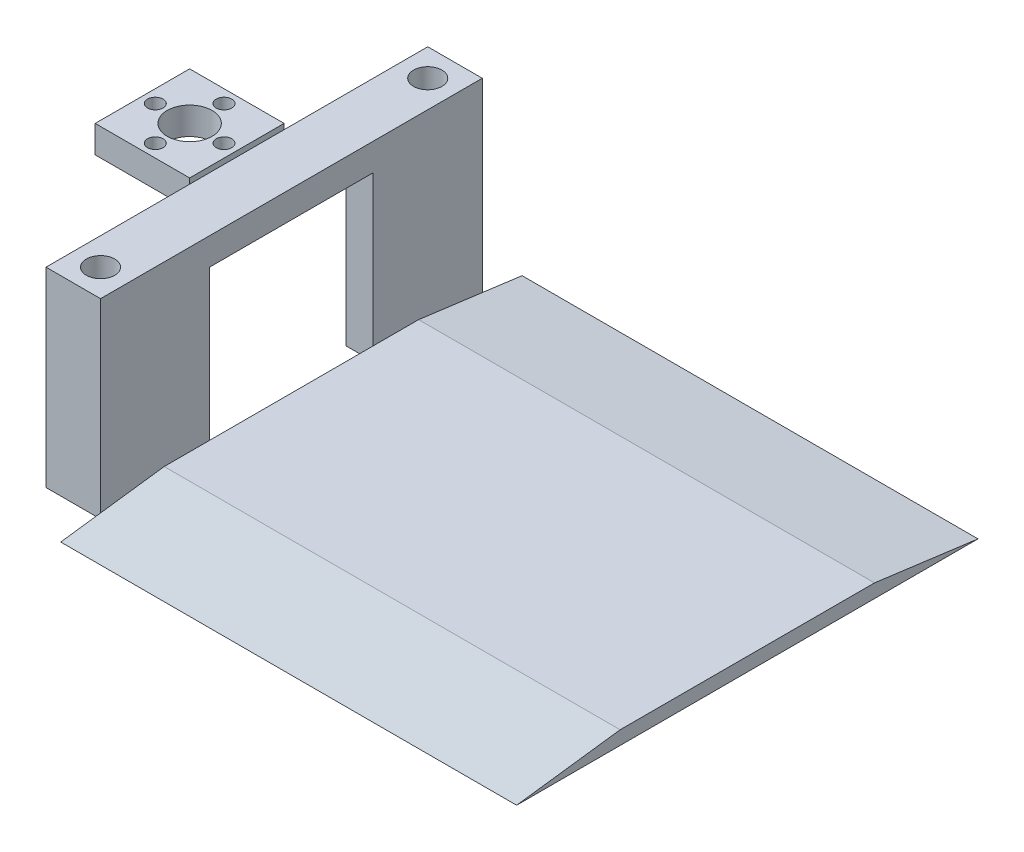
ISO-10303-21;
HEADER;
FILE_DESCRIPTION(('STEP AP214'),'2;1');
FILE_NAME('part.step','',(''),(''),'','','');
FILE_SCHEMA(('AUTOMOTIVE_DESIGN { 1 0 10303 214 1 1 1 1 }'));
ENDSEC;
DATA;
#1=APPLICATION_CONTEXT('core data for automotive mechanical design processes');
#2=APPLICATION_PROTOCOL_DEFINITION('international standard','automotive_design',2000,#1);
#3=PRODUCT_CONTEXT('',#1,'mechanical');
#4=PRODUCT('Part','Part','',(#3));
#5=PRODUCT_RELATED_PRODUCT_CATEGORY('part','',(#4));
#6=PRODUCT_DEFINITION_FORMATION('','',#4);
#7=PRODUCT_DEFINITION_CONTEXT('part definition',#1,'design');
#8=PRODUCT_DEFINITION('design','',#6,#7);
#9=PRODUCT_DEFINITION_SHAPE('','',#8);
#10=(LENGTH_UNIT() NAMED_UNIT(*) SI_UNIT(.MILLI.,.METRE.));
#11=(NAMED_UNIT(*) PLANE_ANGLE_UNIT() SI_UNIT($,.RADIAN.));
#12=(NAMED_UNIT(*) SI_UNIT($,.STERADIAN.) SOLID_ANGLE_UNIT());
#13=UNCERTAINTY_MEASURE_WITH_UNIT(LENGTH_MEASURE(1.E-05),#10,'distance_accuracy_value','');
#14=(GEOMETRIC_REPRESENTATION_CONTEXT(3) GLOBAL_UNCERTAINTY_ASSIGNED_CONTEXT((#13)) GLOBAL_UNIT_ASSIGNED_CONTEXT((#10,
#11,#12)) REPRESENTATION_CONTEXT('',''));
#15=CARTESIAN_POINT('',(0.,0.,0.));
#16=DIRECTION('',(0.,0.,1.));
#17=DIRECTION('',(1.,0.,0.));
#18=AXIS2_PLACEMENT_3D('',#15,#16,#17);
#19=CARTESIAN_POINT('',(-12.7,44.45,-85.471));
#20=DIRECTION('',(1.,0.,0.));
#21=DIRECTION('',(0.,0.,-1.));
#22=AXIS2_PLACEMENT_3D('',#19,#20,#21);
#23=PLANE('',#22);
#24=DIRECTION('',(0.,1.,0.));
#25=VECTOR('',#24,1.);
#26=CARTESIAN_POINT('',(-12.7,39.37,-42.721000029));
#27=LINE('',#26,#25);
#28=CARTESIAN_POINT('',(-12.7,39.37,-42.721000029));
#29=VERTEX_POINT('',#28);
#30=CARTESIAN_POINT('',(-12.7,44.45,-42.721000029));
#31=VERTEX_POINT('',#30);
#32=EDGE_CURVE('E301',#29,#31,#27,.T.);
#33=ORIENTED_EDGE('',*,*,#32,.F.);
#34=DIRECTION('',(0.,0.,-1.));
#35=VECTOR('',#34,1.);
#36=CARTESIAN_POINT('',(-12.7,39.37,-64.720999971));
#37=LINE('',#36,#35);
#38=CARTESIAN_POINT('',(-12.7,39.37,-64.720999971));
#39=VERTEX_POINT('',#38);
#40=EDGE_CURVE('E277',#29,#39,#37,.T.);
#41=ORIENTED_EDGE('',*,*,#40,.T.);
#42=DIRECTION('',(0.,1.,0.));
#43=VECTOR('',#42,1.);
#44=CARTESIAN_POINT('',(-12.7,39.37,-64.720999971));
#45=LINE('',#44,#43);
#46=CARTESIAN_POINT('',(-12.7,44.45,-64.720999971));
#47=VERTEX_POINT('',#46);
#48=EDGE_CURVE('E310',#39,#47,#45,.T.);
#49=ORIENTED_EDGE('',*,*,#48,.T.);
#50=DIRECTION('',(0.,0.,1.));
#51=VECTOR('',#50,1.);
#52=CARTESIAN_POINT('',(-12.7,44.45,-85.471));
#53=LINE('',#52,#51);
#54=CARTESIAN_POINT('',(-12.7,44.45,-98.171));
#55=VERTEX_POINT('',#54);
#56=EDGE_CURVE('E376',#55,#47,#53,.T.);
#57=ORIENTED_EDGE('',*,*,#56,.F.);
#58=DIRECTION('',(0.,-1.,0.));
#59=VECTOR('',#58,1.);
#60=CARTESIAN_POINT('',(-12.7,44.45,-98.171));
#61=LINE('',#60,#59);
#62=CARTESIAN_POINT('',(-12.7,0.,-98.171));
#63=VERTEX_POINT('',#62);
#64=EDGE_CURVE('E388',#55,#63,#61,.T.);
#65=ORIENTED_EDGE('',*,*,#64,.T.);
#66=DIRECTION('',(0.,0.,1.));
#67=VECTOR('',#66,1.);
#68=CARTESIAN_POINT('',(-12.7,0.,-85.471));
#69=LINE('',#68,#67);
#70=CARTESIAN_POINT('',(-12.7,0.,-85.471));
#71=VERTEX_POINT('',#70);
#72=EDGE_CURVE('E382',#63,#71,#69,.T.);
#73=ORIENTED_EDGE('',*,*,#72,.T.);
#74=DIRECTION('',(0.,-1.,0.));
#75=VECTOR('',#74,1.);
#76=CARTESIAN_POINT('',(-12.7,44.45,-85.471));
#77=LINE('',#76,#75);
#78=CARTESIAN_POINT('',(-12.7,38.1,-85.471));
#79=VERTEX_POINT('',#78);
#80=EDGE_CURVE('E379',#79,#71,#77,.T.);
#81=ORIENTED_EDGE('',*,*,#80,.F.);
#82=DIRECTION('',(0.,0.,-1.));
#83=VECTOR('',#82,1.);
#84=CARTESIAN_POINT('',(-12.7,38.1,-7.7719683428763));
#85=LINE('',#84,#83);
#86=CARTESIAN_POINT('',(-12.7,38.1,-21.971));
#87=VERTEX_POINT('',#86);
#88=EDGE_CURVE('E304',#87,#79,#85,.T.);
#89=ORIENTED_EDGE('',*,*,#88,.F.);
#90=DIRECTION('',(0.,-1.,0.));
#91=VECTOR('',#90,1.);
#92=CARTESIAN_POINT('',(-12.7,44.45,-21.971));
#93=LINE('',#92,#91);
#94=CARTESIAN_POINT('',(-12.7,0.,-21.971));
#95=VERTEX_POINT('',#94);
#96=EDGE_CURVE('E342',#87,#95,#93,.T.);
#97=ORIENTED_EDGE('',*,*,#96,.T.);
#98=DIRECTION('',(0.,0.,1.));
#99=VECTOR('',#98,1.);
#100=CARTESIAN_POINT('',(-12.7,0.,-21.971));
#101=LINE('',#100,#99);
#102=CARTESIAN_POINT('',(-12.7,0.,-9.27099999999997));
#103=VERTEX_POINT('',#102);
#104=EDGE_CURVE('E351',#95,#103,#101,.T.);
#105=ORIENTED_EDGE('',*,*,#104,.T.);
#106=DIRECTION('',(0.,-1.,0.));
#107=VECTOR('',#106,1.);
#108=CARTESIAN_POINT('',(-12.7,44.45,-9.27099999999997));
#109=LINE('',#108,#107);
#110=CARTESIAN_POINT('',(-12.7,44.45,-9.27099999999997));
#111=VERTEX_POINT('',#110);
#112=EDGE_CURVE('E331',#111,#103,#109,.T.);
#113=ORIENTED_EDGE('',*,*,#112,.F.);
#114=EDGE_CURVE('E375',#31,#111,#53,.T.);
#115=ORIENTED_EDGE('',*,*,#114,.F.);
#116=EDGE_LOOP('',(#33,#41,#49,#57,#65,#73,#81,#89,#97,#105,#113,#115));
#117=FACE_BOUND('',#116,.T.);
#118=ADVANCED_FACE('F39',(#117),#23,.F.);
#119=CARTESIAN_POINT('',(-12.7,44.45,-85.471));
#120=DIRECTION('',(0.,0.,-1.));
#121=DIRECTION('',(-1.,0.,0.));
#122=AXIS2_PLACEMENT_3D('',#119,#120,#121);
#123=PLANE('',#122);
#124=DIRECTION('',(1.,0.,0.));
#125=VECTOR('',#124,1.);
#126=CARTESIAN_POINT('',(-12.7,0.,-85.471));
#127=LINE('',#126,#125);
#128=CARTESIAN_POINT('',(-6.34999999999998,0.,-85.4710000000001));
#129=VERTEX_POINT('',#128);
#130=EDGE_CURVE('E373',#71,#129,#127,.T.);
#131=ORIENTED_EDGE('',*,*,#130,.T.);
#132=DIRECTION('',(0.,-1.,0.));
#133=VECTOR('',#132,1.);
#134=CARTESIAN_POINT('',(-6.34999999999998,52.2990316571237,-85.4710000000001));
#135=LINE('',#134,#133);
#136=CARTESIAN_POINT('',(-6.34999999999998,38.1,-85.4710000000001));
#137=VERTEX_POINT('',#136);
#138=EDGE_CURVE('E217',#137,#129,#135,.T.);
#139=ORIENTED_EDGE('',*,*,#138,.F.);
#140=DIRECTION('',(1.,0.,0.));
#141=VECTOR('',#140,1.);
#142=CARTESIAN_POINT('',(-12.7,38.1,-85.471));
#143=LINE('',#142,#141);
#144=EDGE_CURVE('E216',#79,#137,#143,.T.);
#145=ORIENTED_EDGE('',*,*,#144,.F.);
#146=ORIENTED_EDGE('',*,*,#80,.T.);
#147=EDGE_LOOP('',(#131,#139,#145,#146));
#148=FACE_BOUND('',#147,.T.);
#149=ADVANCED_FACE('F499',(#148),#123,.F.);
#150=CARTESIAN_POINT('',(-12.7,44.45,-21.971));
#151=DIRECTION('',(0.,0.,1.));
#152=DIRECTION('',(1.,0.,0.));
#153=AXIS2_PLACEMENT_3D('',#150,#151,#152);
#154=PLANE('',#153);
#155=DIRECTION('',(1.,0.,0.));
#156=VECTOR('',#155,1.);
#157=CARTESIAN_POINT('',(-12.7,38.1,-21.971));
#158=LINE('',#157,#156);
#159=CARTESIAN_POINT('',(-6.34999999999999,38.1,-21.971));
#160=VERTEX_POINT('',#159);
#161=EDGE_CURVE('E315',#87,#160,#158,.T.);
#162=ORIENTED_EDGE('',*,*,#161,.T.);
#163=DIRECTION('',(0.,-1.,0.));
#164=VECTOR('',#163,1.);
#165=CARTESIAN_POINT('',(-6.34999999999999,52.2990316571237,-21.971));
#166=LINE('',#165,#164);
#167=CARTESIAN_POINT('',(-6.34999999999999,0.,-21.971));
#168=VERTEX_POINT('',#167);
#169=EDGE_CURVE('E229',#160,#168,#166,.T.);
#170=ORIENTED_EDGE('',*,*,#169,.T.);
#171=DIRECTION('',(-1.,0.,0.));
#172=VECTOR('',#171,1.);
#173=CARTESIAN_POINT('',(-12.7,0.,-21.971));
#174=LINE('',#173,#172);
#175=EDGE_CURVE('E346',#168,#95,#174,.T.);
#176=ORIENTED_EDGE('',*,*,#175,.T.);
#177=ORIENTED_EDGE('',*,*,#96,.F.);
#178=EDGE_LOOP('',(#162,#170,#176,#177));
#179=FACE_BOUND('',#178,.T.);
#180=ADVANCED_FACE('F453',(#179),#154,.F.);
#181=CARTESIAN_POINT('',(0.,3.175,0.));
#182=DIRECTION('',(1.,0.,0.));
#183=DIRECTION('',(0.,0.,-1.));
#184=AXIS2_PLACEMENT_3D('',#181,#182,#183);
#185=PLANE('',#184);
#186=DIRECTION('',(0.,0.,1.));
#187=VECTOR('',#186,1.);
#188=CARTESIAN_POINT('',(0.,0.,0.));
#189=LINE('',#188,#187);
#190=CARTESIAN_POINT('',(0.,0.,-9.27099999999997));
#191=VERTEX_POINT('',#190);
#192=CARTESIAN_POINT('',(0.,0.,0.));
#193=VERTEX_POINT('',#192);
#194=EDGE_CURVE('E390',#191,#193,#189,.T.);
#195=ORIENTED_EDGE('',*,*,#194,.T.);
#196=DIRECTION('',(0.,0.130632606176108,-0.991430845900831));
#197=VECTOR('',#196,1.);
#198=CARTESIAN_POINT('',(0.,0.,0.));
#199=LINE('',#198,#197);
#200=CARTESIAN_POINT('',(0.,1.2215626504522,-9.27099999999997));
#201=VERTEX_POINT('',#200);
#202=EDGE_CURVE('E325',#193,#201,#199,.T.);
#203=ORIENTED_EDGE('',*,*,#202,.T.);
#204=DIRECTION('',(0.,-1.,0.));
#205=VECTOR('',#204,1.);
#206=CARTESIAN_POINT('',(0.,44.45,-9.27099999999997));
#207=LINE('',#206,#205);
#208=EDGE_CURVE('E339',#201,#191,#207,.T.);
#209=ORIENTED_EDGE('',*,*,#208,.T.);
#210=EDGE_LOOP('',(#195,#203,#209));
#211=FACE_BOUND('',#210,.T.);
#212=ADVANCED_FACE('F41',(#211),#185,.F.);
#213=DIRECTION('',(0.,0.,1.));
#214=VECTOR('',#213,1.);
#215=CARTESIAN_POINT('',(0.,3.175,0.));
#216=LINE('',#215,#214);
#217=CARTESIAN_POINT('',(0.,3.17500000000001,-72.771));
#218=VERTEX_POINT('',#217);
#219=CARTESIAN_POINT('',(0.,3.17500000000001,-34.671));
#220=VERTEX_POINT('',#219);
#221=EDGE_CURVE('E396',#218,#220,#216,.T.);
#222=ORIENTED_EDGE('',*,*,#221,.F.);
#223=DIRECTION('',(0.,-1.,0.));
#224=VECTOR('',#223,1.);
#225=CARTESIAN_POINT('',(0.,52.2990316571237,-72.771));
#226=LINE('',#225,#224);
#227=CARTESIAN_POINT('',(0.,0.,-72.771));
#228=VERTEX_POINT('',#227);
#229=EDGE_CURVE('E203',#218,#228,#226,.T.);
#230=ORIENTED_EDGE('',*,*,#229,.T.);
#231=CARTESIAN_POINT('',(0.,0.,-34.671));
#232=VERTEX_POINT('',#231);
#233=EDGE_CURVE('E403',#228,#232,#189,.T.);
#234=ORIENTED_EDGE('',*,*,#233,.T.);
#235=DIRECTION('',(0.,-1.,0.));
#236=VECTOR('',#235,1.);
#237=CARTESIAN_POINT('',(0.,52.2990316571237,-34.671));
#238=LINE('',#237,#236);
#239=EDGE_CURVE('E233',#220,#232,#238,.T.);
#240=ORIENTED_EDGE('',*,*,#239,.F.);
#241=EDGE_LOOP('',(#222,#230,#234,#240));
#242=FACE_BOUND('',#241,.T.);
#243=ADVANCED_FACE('F429',(#242),#185,.F.);
#244=DIRECTION('',(0.,-1.,0.));
#245=VECTOR('',#244,1.);
#246=CARTESIAN_POINT('',(0.,44.45,-98.171));
#247=LINE('',#246,#245);
#248=CARTESIAN_POINT('',(0.,1.22156265045221,-98.171));
#249=VERTEX_POINT('',#248);
#250=CARTESIAN_POINT('',(0.,0.,-98.171));
#251=VERTEX_POINT('',#250);
#252=EDGE_CURVE('E48',#249,#251,#247,.T.);
#253=ORIENTED_EDGE('',*,*,#252,.F.);
#254=DIRECTION('',(0.,-0.130632606176108,-0.991430845900831));
#255=VECTOR('',#254,1.);
#256=CARTESIAN_POINT('',(0.,0.,-107.442));
#257=LINE('',#256,#255);
#258=CARTESIAN_POINT('',(0.,0.,-107.442));
#259=VERTEX_POINT('',#258);
#260=EDGE_CURVE('E333',#249,#259,#257,.T.);
#261=ORIENTED_EDGE('',*,*,#260,.T.);
#262=EDGE_CURVE('E399',#259,#251,#189,.T.);
#263=ORIENTED_EDGE('',*,*,#262,.T.);
#264=EDGE_LOOP('',(#253,#261,#263));
#265=FACE_BOUND('',#264,.T.);
#266=ADVANCED_FACE('F519',(#265),#185,.F.);
#267=CARTESIAN_POINT('',(106.172,3.175,0.));
#268=DIRECTION('',(-1.,0.,0.));
#269=DIRECTION('',(0.,0.,1.));
#270=AXIS2_PLACEMENT_3D('',#267,#268,#269);
#271=PLANE('',#270);
#272=DIRECTION('',(0.,0.,-1.));
#273=VECTOR('',#272,1.);
#274=CARTESIAN_POINT('',(106.172,3.175,0.));
#275=LINE('',#274,#273);
#276=CARTESIAN_POINT('',(106.172,3.175,-24.0965332306971));
#277=VERTEX_POINT('',#276);
#278=CARTESIAN_POINT('',(106.172,3.175,-83.3454667693029));
#279=VERTEX_POINT('',#278);
#280=EDGE_CURVE('E392',#277,#279,#275,.T.);
#281=ORIENTED_EDGE('',*,*,#280,.F.);
#282=DIRECTION('',(0.,0.130632606176108,-0.991430845900831));
#283=VECTOR('',#282,1.);
#284=CARTESIAN_POINT('',(106.172,0.,0.));
#285=LINE('',#284,#283);
#286=CARTESIAN_POINT('',(106.172,0.,0.));
#287=VERTEX_POINT('',#286);
#288=EDGE_CURVE('E321',#287,#277,#285,.T.);
#289=ORIENTED_EDGE('',*,*,#288,.F.);
#290=DIRECTION('',(0.,0.,-1.));
#291=VECTOR('',#290,1.);
#292=CARTESIAN_POINT('',(106.172,0.,0.));
#293=LINE('',#292,#291);
#294=CARTESIAN_POINT('',(106.172,0.,-107.442));
#295=VERTEX_POINT('',#294);
#296=EDGE_CURVE('E404',#287,#295,#293,.T.);
#297=ORIENTED_EDGE('',*,*,#296,.T.);
#298=DIRECTION('',(0.,-0.130632606176108,-0.991430845900831));
#299=VECTOR('',#298,1.);
#300=CARTESIAN_POINT('',(106.172,0.,-107.442));
#301=LINE('',#300,#299);
#302=EDGE_CURVE('E324',#279,#295,#301,.T.);
#303=ORIENTED_EDGE('',*,*,#302,.F.);
#304=EDGE_LOOP('',(#281,#289,#297,#303));
#305=FACE_BOUND('',#304,.T.);
#306=ADVANCED_FACE('F443',(#305),#271,.F.);
#307=CARTESIAN_POINT('',(0.,3.175,0.));
#308=DIRECTION('',(0.,-1.,0.));
#309=DIRECTION('',(0.,0.,-1.));
#310=AXIS2_PLACEMENT_3D('',#307,#308,#309);
#311=PLANE('',#310);
#312=CARTESIAN_POINT('',(0.,3.175,-83.3454667693029));
#313=VERTEX_POINT('',#312);
#314=EDGE_CURVE('E393',#313,#218,#216,.T.);
#315=ORIENTED_EDGE('',*,*,#314,.T.);
#316=ORIENTED_EDGE('',*,*,#221,.T.);
#317=DIRECTION('',(0.,0.,1.));
#318=VECTOR('',#317,1.);
#319=CARTESIAN_POINT('',(0.,3.175,0.));
#320=LINE('',#319,#318);
#321=CARTESIAN_POINT('',(0.,3.175,-24.0965332306971));
#322=VERTEX_POINT('',#321);
#323=EDGE_CURVE('E240',#220,#322,#320,.T.);
#324=ORIENTED_EDGE('',*,*,#323,.T.);
#325=DIRECTION('',(1.,0.,0.));
#326=VECTOR('',#325,1.);
#327=CARTESIAN_POINT('',(-24.3048048487966,3.175,-24.0965332306971));
#328=LINE('',#327,#326);
#329=EDGE_CURVE('E328',#322,#277,#328,.T.);
#330=ORIENTED_EDGE('',*,*,#329,.T.);
#331=ORIENTED_EDGE('',*,*,#280,.T.);
#332=DIRECTION('',(1.,0.,0.));
#333=VECTOR('',#332,1.);
#334=CARTESIAN_POINT('',(-24.3048048487966,3.175,-83.3454667693029));
#335=LINE('',#334,#333);
#336=EDGE_CURVE('E318',#313,#279,#335,.T.);
#337=ORIENTED_EDGE('',*,*,#336,.F.);
#338=EDGE_LOOP('',(#315,#316,#324,#330,#331,#337));
#339=FACE_BOUND('',#338,.T.);
#340=ADVANCED_FACE('F417',(#339),#311,.F.);
#341=CARTESIAN_POINT('',(0.,0.,0.));
#342=DIRECTION('',(0.,-1.,0.));
#343=DIRECTION('',(0.,0.,-1.));
#344=AXIS2_PLACEMENT_3D('',#341,#342,#343);
#345=PLANE('',#344);
#346=ORIENTED_EDGE('',*,*,#175,.F.);
#347=DIRECTION('',(0.,0.,-1.));
#348=VECTOR('',#347,1.);
#349=CARTESIAN_POINT('',(-6.35,0.,-34.671));
#350=LINE('',#349,#348);
#351=CARTESIAN_POINT('',(-6.35,0.,-34.671));
#352=VERTEX_POINT('',#351);
#353=EDGE_CURVE('E224',#168,#352,#350,.T.);
#354=ORIENTED_EDGE('',*,*,#353,.T.);
#355=DIRECTION('',(1.,0.,0.));
#356=VECTOR('',#355,1.);
#357=CARTESIAN_POINT('',(0.,0.,-34.671));
#358=LINE('',#357,#356);
#359=EDGE_CURVE('E226',#352,#232,#358,.T.);
#360=ORIENTED_EDGE('',*,*,#359,.T.);
#361=ORIENTED_EDGE('',*,*,#233,.F.);
#362=DIRECTION('',(-1.,0.,0.));
#363=VECTOR('',#362,1.);
#364=CARTESIAN_POINT('',(0.,0.,-72.771));
#365=LINE('',#364,#363);
#366=CARTESIAN_POINT('',(-6.35,0.,-72.771));
#367=VERTEX_POINT('',#366);
#368=EDGE_CURVE('E219',#228,#367,#365,.T.);
#369=ORIENTED_EDGE('',*,*,#368,.T.);
#370=DIRECTION('',(0.,0.,-1.));
#371=VECTOR('',#370,1.);
#372=CARTESIAN_POINT('',(-6.35,0.,-72.771));
#373=LINE('',#372,#371);
#374=EDGE_CURVE('E210',#367,#129,#373,.T.);
#375=ORIENTED_EDGE('',*,*,#374,.T.);
#376=ORIENTED_EDGE('',*,*,#130,.F.);
#377=ORIENTED_EDGE('',*,*,#72,.F.);
#378=DIRECTION('',(-1.,0.,0.));
#379=VECTOR('',#378,1.);
#380=CARTESIAN_POINT('',(-12.7,0.,-98.171));
#381=LINE('',#380,#379);
#382=EDGE_CURVE('E366',#251,#63,#381,.T.);
#383=ORIENTED_EDGE('',*,*,#382,.F.);
#384=ORIENTED_EDGE('',*,*,#262,.F.);
#385=DIRECTION('',(-1.,0.,0.));
#386=VECTOR('',#385,1.);
#387=CARTESIAN_POINT('',(0.,0.,-107.442));
#388=LINE('',#387,#386);
#389=EDGE_CURVE('E43',#295,#259,#388,.T.);
#390=ORIENTED_EDGE('',*,*,#389,.F.);
#391=ORIENTED_EDGE('',*,*,#296,.F.);
#392=DIRECTION('',(1.,0.,0.));
#393=VECTOR('',#392,1.);
#394=CARTESIAN_POINT('',(0.,0.,0.));
#395=LINE('',#394,#393);
#396=EDGE_CURVE('E402',#193,#287,#395,.T.);
#397=ORIENTED_EDGE('',*,*,#396,.F.);
#398=ORIENTED_EDGE('',*,*,#194,.F.);
#399=DIRECTION('',(1.,0.,0.));
#400=VECTOR('',#399,1.);
#401=CARTESIAN_POINT('',(-12.7,0.,-9.27099999999997));
#402=LINE('',#401,#400);
#403=EDGE_CURVE('E348',#103,#191,#402,.T.);
#404=ORIENTED_EDGE('',*,*,#403,.F.);
#405=ORIENTED_EDGE('',*,*,#104,.F.);
#406=EDGE_LOOP('',(#346,#354,#360,#361,#369,#375,#376,#377,#383,#384,#390,#391,#397,#398,#404,#405));
#407=FACE_BOUND('',#406,.T.);
#408=CARTESIAN_POINT('',(-6.35,0.,-91.821));
#409=DIRECTION('',(0.,1.,0.));
#410=DIRECTION('',(0.,0.,1.));
#411=AXIS2_PLACEMENT_3D('',#408,#409,#410);
#412=CIRCLE('',#411,3.302);
#413=CARTESIAN_POINT('',(-6.35,0.,-88.519));
#414=VERTEX_POINT('',#413);
#415=EDGE_CURVE('E360',#414,#414,#412,.T.);
#416=ORIENTED_EDGE('',*,*,#415,.T.);
#417=EDGE_LOOP('',(#416));
#418=FACE_BOUND('',#417,.T.);
#419=CARTESIAN_POINT('',(-6.35,0.,-15.6210000000001));
#420=DIRECTION('',(0.,1.,0.));
#421=DIRECTION('',(0.,0.,-1.));
#422=AXIS2_PLACEMENT_3D('',#419,#420,#421);
#423=CIRCLE('',#422,3.302);
#424=CARTESIAN_POINT('',(-6.35,0.,-18.9230000000001));
#425=VERTEX_POINT('',#424);
#426=EDGE_CURVE('E357',#425,#425,#423,.T.);
#427=ORIENTED_EDGE('',*,*,#426,.T.);
#428=EDGE_LOOP('',(#427));
#429=FACE_BOUND('',#428,.T.);
#430=ADVANCED_FACE('F438',(#407,#418,#429),#345,.T.);
#431=CARTESIAN_POINT('',(0.,44.45,0.));
#432=DIRECTION('',(0.,-1.,0.));
#433=DIRECTION('',(0.,0.,-1.));
#434=AXIS2_PLACEMENT_3D('',#431,#432,#433);
#435=PLANE('',#434);
#436=DIRECTION('',(0.,0.,-1.));
#437=VECTOR('',#436,1.);
#438=CARTESIAN_POINT('',(0.,44.45,-85.471));
#439=LINE('',#438,#437);
#440=CARTESIAN_POINT('',(0.,44.45,-9.27099999999997));
#441=VERTEX_POINT('',#440);
#442=CARTESIAN_POINT('',(0.,44.45,-98.171));
#443=VERTEX_POINT('',#442);
#444=EDGE_CURVE('E369',#441,#443,#439,.T.);
#445=ORIENTED_EDGE('',*,*,#444,.T.);
#446=DIRECTION('',(-1.,0.,0.));
#447=VECTOR('',#446,1.);
#448=CARTESIAN_POINT('',(-12.7,44.45,-98.171));
#449=LINE('',#448,#447);
#450=EDGE_CURVE('E372',#443,#55,#449,.T.);
#451=ORIENTED_EDGE('',*,*,#450,.T.);
#452=ORIENTED_EDGE('',*,*,#56,.T.);
#453=EDGE_CURVE('E380',#47,#31,#53,.T.);
#454=ORIENTED_EDGE('',*,*,#453,.T.);
#455=ORIENTED_EDGE('',*,*,#114,.T.);
#456=DIRECTION('',(1.,0.,0.));
#457=VECTOR('',#456,1.);
#458=CARTESIAN_POINT('',(-12.7,44.45,-9.27099999999997));
#459=LINE('',#458,#457);
#460=EDGE_CURVE('E345',#111,#441,#459,.T.);
#461=ORIENTED_EDGE('',*,*,#460,.T.);
#462=EDGE_LOOP('',(#445,#451,#452,#454,#455,#461));
#463=FACE_BOUND('',#462,.T.);
#464=CARTESIAN_POINT('',(-6.35,44.45,-91.821));
#465=DIRECTION('',(0.,1.,0.));
#466=DIRECTION('',(0.,0.,1.));
#467=AXIS2_PLACEMENT_3D('',#464,#465,#466);
#468=CIRCLE('',#467,3.302);
#469=CARTESIAN_POINT('',(-6.35,44.45,-88.519));
#470=VERTEX_POINT('',#469);
#471=EDGE_CURVE('E363',#470,#470,#468,.T.);
#472=ORIENTED_EDGE('',*,*,#471,.F.);
#473=EDGE_LOOP('',(#472));
#474=FACE_BOUND('',#473,.T.);
#475=CARTESIAN_POINT('',(-6.35,44.45,-15.6210000000001));
#476=DIRECTION('',(0.,1.,0.));
#477=DIRECTION('',(0.,0.,-1.));
#478=AXIS2_PLACEMENT_3D('',#475,#476,#477);
#479=CIRCLE('',#478,3.302);
#480=CARTESIAN_POINT('',(-6.35,44.45,-18.9230000000001));
#481=VERTEX_POINT('',#480);
#482=EDGE_CURVE('E354',#481,#481,#479,.T.);
#483=ORIENTED_EDGE('',*,*,#482,.F.);
#484=EDGE_LOOP('',(#483));
#485=FACE_BOUND('',#484,.T.);
#486=ADVANCED_FACE('F467',(#463,#474,#485),#435,.F.);
#487=CARTESIAN_POINT('',(0.,44.45,-85.471));
#488=DIRECTION('',(-1.,0.,0.));
#489=DIRECTION('',(0.,0.,1.));
#490=AXIS2_PLACEMENT_3D('',#487,#488,#489);
#491=PLANE('',#490);
#492=EDGE_CURVE('E334',#313,#249,#257,.T.);
#493=ORIENTED_EDGE('',*,*,#492,.T.);
#494=EDGE_CURVE('E11',#443,#249,#247,.T.);
#495=ORIENTED_EDGE('',*,*,#494,.F.);
#496=ORIENTED_EDGE('',*,*,#444,.F.);
#497=EDGE_CURVE('E340',#441,#201,#207,.T.);
#498=ORIENTED_EDGE('',*,*,#497,.T.);
#499=EDGE_CURVE('E323',#201,#322,#199,.T.);
#500=ORIENTED_EDGE('',*,*,#499,.T.);
#501=ORIENTED_EDGE('',*,*,#323,.F.);
#502=CARTESIAN_POINT('',(0.,38.1,-34.671));
#503=VERTEX_POINT('',#502);
#504=EDGE_CURVE('E238',#503,#220,#238,.T.);
#505=ORIENTED_EDGE('',*,*,#504,.F.);
#506=DIRECTION('',(0.,0.,-1.));
#507=VECTOR('',#506,1.);
#508=CARTESIAN_POINT('',(0.,38.1,-7.7719683428763));
#509=LINE('',#508,#507);
#510=CARTESIAN_POINT('',(0.,38.1,-72.771));
#511=VERTEX_POINT('',#510);
#512=EDGE_CURVE('E314',#503,#511,#509,.T.);
#513=ORIENTED_EDGE('',*,*,#512,.T.);
#514=EDGE_CURVE('E56',#511,#218,#226,.T.);
#515=ORIENTED_EDGE('',*,*,#514,.T.);
#516=ORIENTED_EDGE('',*,*,#314,.F.);
#517=EDGE_LOOP('',(#493,#495,#496,#498,#500,#501,#505,#513,#515,#516));
#518=FACE_BOUND('',#517,.T.);
#519=ADVANCED_FACE('F424',(#518),#491,.F.);
#520=CARTESIAN_POINT('',(-12.7,44.45,-98.171));
#521=DIRECTION('',(0.,0.,1.));
#522=DIRECTION('',(1.,0.,0.));
#523=AXIS2_PLACEMENT_3D('',#520,#521,#522);
#524=PLANE('',#523);
#525=ORIENTED_EDGE('',*,*,#382,.T.);
#526=ORIENTED_EDGE('',*,*,#64,.F.);
#527=ORIENTED_EDGE('',*,*,#450,.F.);
#528=ORIENTED_EDGE('',*,*,#494,.T.);
#529=ORIENTED_EDGE('',*,*,#252,.T.);
#530=EDGE_LOOP('',(#525,#526,#527,#528,#529));
#531=FACE_BOUND('',#530,.T.);
#532=ADVANCED_FACE('F508',(#531),#524,.F.);
#533=CARTESIAN_POINT('',(-6.35,44.45,-91.821));
#534=DIRECTION('',(0.,-1.,0.));
#535=DIRECTION('',(0.,0.,-1.));
#536=AXIS2_PLACEMENT_3D('',#533,#534,#535);
#537=CYLINDRICAL_SURFACE('',#536,3.302);
#538=ORIENTED_EDGE('',*,*,#471,.T.);
#539=EDGE_LOOP('',(#538));
#540=FACE_BOUND('',#539,.T.);
#541=ORIENTED_EDGE('',*,*,#415,.F.);
#542=EDGE_LOOP('',(#541));
#543=FACE_BOUND('',#542,.T.);
#544=ADVANCED_FACE('F511',(#540,#543),#537,.F.);
#545=CARTESIAN_POINT('',(-12.7,44.45,-9.27099999999997));
#546=DIRECTION('',(0.,0.,-1.));
#547=DIRECTION('',(-1.,0.,0.));
#548=AXIS2_PLACEMENT_3D('',#545,#546,#547);
#549=PLANE('',#548);
#550=ORIENTED_EDGE('',*,*,#403,.T.);
#551=ORIENTED_EDGE('',*,*,#208,.F.);
#552=ORIENTED_EDGE('',*,*,#497,.F.);
#553=ORIENTED_EDGE('',*,*,#460,.F.);
#554=ORIENTED_EDGE('',*,*,#112,.T.);
#555=EDGE_LOOP('',(#550,#551,#552,#553,#554));
#556=FACE_BOUND('',#555,.T.);
#557=ADVANCED_FACE('F461',(#556),#549,.F.);
#558=CARTESIAN_POINT('',(-6.35,44.45,-15.6210000000001));
#559=DIRECTION('',(0.,-1.,0.));
#560=DIRECTION('',(0.,0.,-1.));
#561=AXIS2_PLACEMENT_3D('',#558,#559,#560);
#562=CYLINDRICAL_SURFACE('',#561,3.302);
#563=ORIENTED_EDGE('',*,*,#482,.T.);
#564=EDGE_LOOP('',(#563));
#565=FACE_BOUND('',#564,.T.);
#566=ORIENTED_EDGE('',*,*,#426,.F.);
#567=EDGE_LOOP('',(#566));
#568=FACE_BOUND('',#567,.T.);
#569=ADVANCED_FACE('F537',(#565,#568),#562,.F.);
#570=CARTESIAN_POINT('',(-24.3048048487966,0.,0.));
#571=DIRECTION('',(0.,-0.991430845900831,-0.130632606176108));
#572=DIRECTION('',(0.,0.130632606176108,-0.991430845900831));
#573=AXIS2_PLACEMENT_3D('',#570,#571,#572);
#574=PLANE('',#573);
#575=ORIENTED_EDGE('',*,*,#396,.T.);
#576=ORIENTED_EDGE('',*,*,#288,.T.);
#577=ORIENTED_EDGE('',*,*,#329,.F.);
#578=ORIENTED_EDGE('',*,*,#499,.F.);
#579=ORIENTED_EDGE('',*,*,#202,.F.);
#580=EDGE_LOOP('',(#575,#576,#577,#578,#579));
#581=FACE_BOUND('',#580,.T.);
#582=ADVANCED_FACE('F441',(#581),#574,.F.);
#583=CARTESIAN_POINT('',(-24.3048048487966,0.,-107.442));
#584=DIRECTION('',(0.,-0.991430845900831,0.130632606176108));
#585=DIRECTION('',(0.,-0.130632606176108,-0.991430845900831));
#586=AXIS2_PLACEMENT_3D('',#583,#584,#585);
#587=PLANE('',#586);
#588=ORIENTED_EDGE('',*,*,#336,.T.);
#589=ORIENTED_EDGE('',*,*,#302,.T.);
#590=ORIENTED_EDGE('',*,*,#389,.T.);
#591=ORIENTED_EDGE('',*,*,#260,.F.);
#592=ORIENTED_EDGE('',*,*,#492,.F.);
#593=EDGE_LOOP('',(#588,#589,#590,#591,#592));
#594=FACE_BOUND('',#593,.T.);
#595=ADVANCED_FACE('F445',(#594),#587,.F.);
#596=CARTESIAN_POINT('',(-12.7,38.1,-7.7719683428763));
#597=DIRECTION('',(0.,1.,0.));
#598=DIRECTION('',(0.,0.,1.));
#599=AXIS2_PLACEMENT_3D('',#596,#597,#598);
#600=PLANE('',#599);
#601=ORIENTED_EDGE('',*,*,#144,.T.);
#602=DIRECTION('',(0.,0.,-1.));
#603=VECTOR('',#602,1.);
#604=CARTESIAN_POINT('',(-6.35,38.1,-72.771));
#605=LINE('',#604,#603);
#606=CARTESIAN_POINT('',(-6.35,38.1,-72.771));
#607=VERTEX_POINT('',#606);
#608=EDGE_CURVE('E207',#607,#137,#605,.T.);
#609=ORIENTED_EDGE('',*,*,#608,.F.);
#610=DIRECTION('',(-1.,0.,0.));
#611=VECTOR('',#610,1.);
#612=CARTESIAN_POINT('',(0.,38.1,-72.771));
#613=LINE('',#612,#611);
#614=EDGE_CURVE('E194',#511,#607,#613,.T.);
#615=ORIENTED_EDGE('',*,*,#614,.F.);
#616=ORIENTED_EDGE('',*,*,#512,.F.);
#617=DIRECTION('',(1.,0.,0.));
#618=VECTOR('',#617,1.);
#619=CARTESIAN_POINT('',(0.,38.1,-34.671));
#620=LINE('',#619,#618);
#621=CARTESIAN_POINT('',(-6.35,38.1,-34.671));
#622=VERTEX_POINT('',#621);
#623=EDGE_CURVE('E64',#622,#503,#620,.T.);
#624=ORIENTED_EDGE('',*,*,#623,.F.);
#625=DIRECTION('',(0.,0.,-1.));
#626=VECTOR('',#625,1.);
#627=CARTESIAN_POINT('',(-6.35,38.1,-34.671));
#628=LINE('',#627,#626);
#629=EDGE_CURVE('E235',#160,#622,#628,.T.);
#630=ORIENTED_EDGE('',*,*,#629,.F.);
#631=ORIENTED_EDGE('',*,*,#161,.F.);
#632=ORIENTED_EDGE('',*,*,#88,.T.);
#633=EDGE_LOOP('',(#601,#609,#615,#616,#624,#630,#631,#632));
#634=FACE_BOUND('',#633,.T.);
#635=ADVANCED_FACE('F214',(#634),#600,.F.);
#636=CARTESIAN_POINT('',(-12.7,39.37,-64.720999971));
#637=DIRECTION('',(1.,0.,0.));
#638=DIRECTION('',(0.,0.,-1.));
#639=AXIS2_PLACEMENT_3D('',#636,#637,#638);
#640=PLANE('',#639);
#641=ORIENTED_EDGE('',*,*,#453,.F.);
#642=CARTESIAN_POINT('',(-12.7,45.72,-64.720999971));
#643=VERTEX_POINT('',#642);
#644=EDGE_CURVE('E290',#47,#643,#45,.T.);
#645=ORIENTED_EDGE('',*,*,#644,.T.);
#646=DIRECTION('',(0.,0.,-1.));
#647=VECTOR('',#646,1.);
#648=CARTESIAN_POINT('',(-12.7,45.72,-64.720999971));
#649=LINE('',#648,#647);
#650=CARTESIAN_POINT('',(-12.7,45.72,-42.721000029));
#651=VERTEX_POINT('',#650);
#652=EDGE_CURVE('E274',#651,#643,#649,.T.);
#653=ORIENTED_EDGE('',*,*,#652,.F.);
#654=EDGE_CURVE('E305',#31,#651,#27,.T.);
#655=ORIENTED_EDGE('',*,*,#654,.F.);
#656=EDGE_LOOP('',(#641,#645,#653,#655));
#657=FACE_BOUND('',#656,.T.);
#658=ADVANCED_FACE('F471',(#657),#640,.T.);
#659=CARTESIAN_POINT('',(-12.7,39.37,-42.721000029));
#660=DIRECTION('',(0.,0.,1.));
#661=DIRECTION('',(1.,0.,0.));
#662=AXIS2_PLACEMENT_3D('',#659,#660,#661);
#663=PLANE('',#662);
#664=DIRECTION('',(1.,0.,0.));
#665=VECTOR('',#664,1.);
#666=CARTESIAN_POINT('',(-12.7,45.72,-42.721000029));
#667=LINE('',#666,#665);
#668=CARTESIAN_POINT('',(-34.699999942,45.72,-42.721000029));
#669=VERTEX_POINT('',#668);
#670=EDGE_CURVE('E281',#669,#651,#667,.T.);
#671=ORIENTED_EDGE('',*,*,#670,.F.);
#672=DIRECTION('',(0.,1.,0.));
#673=VECTOR('',#672,1.);
#674=CARTESIAN_POINT('',(-34.699999942,39.37,-42.721000029));
#675=LINE('',#674,#673);
#676=CARTESIAN_POINT('',(-34.699999942,39.37,-42.721000029));
#677=VERTEX_POINT('',#676);
#678=EDGE_CURVE('E306',#677,#669,#675,.T.);
#679=ORIENTED_EDGE('',*,*,#678,.F.);
#680=DIRECTION('',(1.,0.,0.));
#681=VECTOR('',#680,1.);
#682=CARTESIAN_POINT('',(-12.7,39.37,-42.721000029));
#683=LINE('',#682,#681);
#684=EDGE_CURVE('E287',#677,#29,#683,.T.);
#685=ORIENTED_EDGE('',*,*,#684,.T.);
#686=ORIENTED_EDGE('',*,*,#32,.T.);
#687=ORIENTED_EDGE('',*,*,#654,.T.);
#688=EDGE_LOOP('',(#671,#679,#685,#686,#687));
#689=FACE_BOUND('',#688,.T.);
#690=ADVANCED_FACE('F488',(#689),#663,.T.);
#691=CARTESIAN_POINT('',(-34.699999942,39.37,-64.720999971));
#692=DIRECTION('',(-1.,0.,0.));
#693=DIRECTION('',(0.,0.,1.));
#694=AXIS2_PLACEMENT_3D('',#691,#692,#693);
#695=PLANE('',#694);
#696=DIRECTION('',(0.,0.,1.));
#697=VECTOR('',#696,1.);
#698=CARTESIAN_POINT('',(-34.699999942,45.72,-64.720999971));
#699=LINE('',#698,#697);
#700=CARTESIAN_POINT('',(-34.699999942,45.72,-64.720999971));
#701=VERTEX_POINT('',#700);
#702=EDGE_CURVE('E296',#701,#669,#699,.T.);
#703=ORIENTED_EDGE('',*,*,#702,.F.);
#704=DIRECTION('',(0.,1.,0.));
#705=VECTOR('',#704,1.);
#706=CARTESIAN_POINT('',(-34.699999942,39.37,-64.720999971));
#707=LINE('',#706,#705);
#708=CARTESIAN_POINT('',(-34.699999942,39.37,-64.720999971));
#709=VERTEX_POINT('',#708);
#710=EDGE_CURVE('E308',#709,#701,#707,.T.);
#711=ORIENTED_EDGE('',*,*,#710,.F.);
#712=DIRECTION('',(0.,0.,1.));
#713=VECTOR('',#712,1.);
#714=CARTESIAN_POINT('',(-34.699999942,39.37,-64.720999971));
#715=LINE('',#714,#713);
#716=EDGE_CURVE('E284',#709,#677,#715,.T.);
#717=ORIENTED_EDGE('',*,*,#716,.T.);
#718=ORIENTED_EDGE('',*,*,#678,.T.);
#719=EDGE_LOOP('',(#703,#711,#717,#718));
#720=FACE_BOUND('',#719,.T.);
#721=ADVANCED_FACE('F483',(#720),#695,.T.);
#722=CARTESIAN_POINT('',(-12.7,39.37,-64.720999971));
#723=DIRECTION('',(0.,0.,-1.));
#724=DIRECTION('',(-1.,0.,0.));
#725=AXIS2_PLACEMENT_3D('',#722,#723,#724);
#726=PLANE('',#725);
#727=DIRECTION('',(-1.,0.,0.));
#728=VECTOR('',#727,1.);
#729=CARTESIAN_POINT('',(-12.7,45.72,-64.720999971));
#730=LINE('',#729,#728);
#731=EDGE_CURVE('E293',#643,#701,#730,.T.);
#732=ORIENTED_EDGE('',*,*,#731,.F.);
#733=ORIENTED_EDGE('',*,*,#644,.F.);
#734=ORIENTED_EDGE('',*,*,#48,.F.);
#735=DIRECTION('',(-1.,0.,0.));
#736=VECTOR('',#735,1.);
#737=CARTESIAN_POINT('',(-12.7,39.37,-64.720999971));
#738=LINE('',#737,#736);
#739=EDGE_CURVE('E280',#39,#709,#738,.T.);
#740=ORIENTED_EDGE('',*,*,#739,.T.);
#741=ORIENTED_EDGE('',*,*,#710,.T.);
#742=EDGE_LOOP('',(#732,#733,#734,#740,#741));
#743=FACE_BOUND('',#742,.T.);
#744=ADVANCED_FACE('F476',(#743),#726,.T.);
#745=CARTESIAN_POINT('',(0.,39.37,0.));
#746=DIRECTION('',(0.,-1.,0.));
#747=DIRECTION('',(0.,0.,-1.));
#748=AXIS2_PLACEMENT_3D('',#745,#746,#747);
#749=PLANE('',#748);
#750=CARTESIAN_POINT('',(-31.6999999729998,39.37,-53.7209999999999));
#751=DIRECTION('',(0.,1.,0.));
#752=DIRECTION('',(0.,0.,1.));
#753=AXIS2_PLACEMENT_3D('',#750,#751,#752);
#754=CIRCLE('',#753,1.813500056);
#755=CARTESIAN_POINT('',(-31.6999999729998,39.37,-51.9074999439999));
#756=VERTEX_POINT('',#755);
#757=EDGE_CURVE('E247',#756,#756,#754,.T.);
#758=ORIENTED_EDGE('',*,*,#757,.T.);
#759=EDGE_LOOP('',(#758));
#760=FACE_BOUND('',#759,.T.);
#761=CARTESIAN_POINT('',(-23.6999999709997,39.37,-45.720999998));
#762=DIRECTION('',(0.,1.,0.));
#763=DIRECTION('',(0.,0.,1.));
#764=AXIS2_PLACEMENT_3D('',#761,#762,#763);
#765=CIRCLE('',#764,1.813500056);
#766=CARTESIAN_POINT('',(-23.6999999709997,39.37,-43.907499942));
#767=VERTEX_POINT('',#766);
#768=EDGE_CURVE('E253',#767,#767,#765,.T.);
#769=ORIENTED_EDGE('',*,*,#768,.T.);
#770=EDGE_LOOP('',(#769));
#771=FACE_BOUND('',#770,.T.);
#772=CARTESIAN_POINT('',(-15.6999999689998,39.37,-53.7210000000002));
#773=DIRECTION('',(0.,1.,0.));
#774=DIRECTION('',(0.,0.,1.));
#775=AXIS2_PLACEMENT_3D('',#772,#773,#774);
#776=CIRCLE('',#775,1.813500056);
#777=CARTESIAN_POINT('',(-15.6999999689998,39.37,-51.9074999440002));
#778=VERTEX_POINT('',#777);
#779=EDGE_CURVE('E259',#778,#778,#776,.T.);
#780=ORIENTED_EDGE('',*,*,#779,.T.);
#781=EDGE_LOOP('',(#780));
#782=FACE_BOUND('',#781,.T.);
#783=CARTESIAN_POINT('',(-23.699999971,39.37,-61.721000002));
#784=DIRECTION('',(0.,1.,0.));
#785=DIRECTION('',(0.,0.,1.));
#786=AXIS2_PLACEMENT_3D('',#783,#784,#785);
#787=CIRCLE('',#786,1.813500056);
#788=CARTESIAN_POINT('',(-23.699999971,39.37,-59.907499946));
#789=VERTEX_POINT('',#788);
#790=EDGE_CURVE('E265',#789,#789,#787,.T.);
#791=ORIENTED_EDGE('',*,*,#790,.T.);
#792=EDGE_LOOP('',(#791));
#793=FACE_BOUND('',#792,.T.);
#794=CARTESIAN_POINT('',(-23.699999971,39.37,-53.721));
#795=DIRECTION('',(0.,1.,0.));
#796=DIRECTION('',(0.,0.,1.));
#797=AXIS2_PLACEMENT_3D('',#794,#795,#796);
#798=CIRCLE('',#797,5.22699996);
#799=CARTESIAN_POINT('',(-23.699999971,39.37,-48.49400004));
#800=VERTEX_POINT('',#799);
#801=EDGE_CURVE('E271',#800,#800,#798,.T.);
#802=ORIENTED_EDGE('',*,*,#801,.T.);
#803=EDGE_LOOP('',(#802));
#804=FACE_BOUND('',#803,.T.);
#805=ORIENTED_EDGE('',*,*,#40,.F.);
#806=ORIENTED_EDGE('',*,*,#684,.F.);
#807=ORIENTED_EDGE('',*,*,#716,.F.);
#808=ORIENTED_EDGE('',*,*,#739,.F.);
#809=EDGE_LOOP('',(#805,#806,#807,#808));
#810=FACE_BOUND('',#809,.T.);
#811=ADVANCED_FACE('F479',(#760,#771,#782,#793,#804,#810),#749,.T.);
#812=CARTESIAN_POINT('',(0.,45.72,0.));
#813=DIRECTION('',(0.,-1.,0.));
#814=DIRECTION('',(0.,0.,-1.));
#815=AXIS2_PLACEMENT_3D('',#812,#813,#814);
#816=PLANE('',#815);
#817=CARTESIAN_POINT('',(-31.6999999729998,45.72,-53.7209999999999));
#818=DIRECTION('',(0.,1.,0.));
#819=DIRECTION('',(0.,0.,1.));
#820=AXIS2_PLACEMENT_3D('',#817,#818,#819);
#821=CIRCLE('',#820,1.813500056);
#822=CARTESIAN_POINT('',(-31.6999999729998,45.72,-51.9074999439999));
#823=VERTEX_POINT('',#822);
#824=EDGE_CURVE('E246',#823,#823,#821,.T.);
#825=ORIENTED_EDGE('',*,*,#824,.F.);
#826=EDGE_LOOP('',(#825));
#827=FACE_BOUND('',#826,.T.);
#828=CARTESIAN_POINT('',(-23.6999999709997,45.72,-45.720999998));
#829=DIRECTION('',(0.,1.,0.));
#830=DIRECTION('',(0.,0.,1.));
#831=AXIS2_PLACEMENT_3D('',#828,#829,#830);
#832=CIRCLE('',#831,1.813500056);
#833=CARTESIAN_POINT('',(-23.6999999709997,45.72,-43.907499942));
#834=VERTEX_POINT('',#833);
#835=EDGE_CURVE('E250',#834,#834,#832,.T.);
#836=ORIENTED_EDGE('',*,*,#835,.F.);
#837=EDGE_LOOP('',(#836));
#838=FACE_BOUND('',#837,.T.);
#839=CARTESIAN_POINT('',(-15.6999999689998,45.72,-53.7210000000002));
#840=DIRECTION('',(0.,1.,0.));
#841=DIRECTION('',(0.,0.,1.));
#842=AXIS2_PLACEMENT_3D('',#839,#840,#841);
#843=CIRCLE('',#842,1.813500056);
#844=CARTESIAN_POINT('',(-15.6999999689998,45.72,-51.9074999440002));
#845=VERTEX_POINT('',#844);
#846=EDGE_CURVE('E256',#845,#845,#843,.T.);
#847=ORIENTED_EDGE('',*,*,#846,.F.);
#848=EDGE_LOOP('',(#847));
#849=FACE_BOUND('',#848,.T.);
#850=CARTESIAN_POINT('',(-23.699999971,45.72,-61.721000002));
#851=DIRECTION('',(0.,1.,0.));
#852=DIRECTION('',(0.,0.,1.));
#853=AXIS2_PLACEMENT_3D('',#850,#851,#852);
#854=CIRCLE('',#853,1.813500056);
#855=CARTESIAN_POINT('',(-23.699999971,45.72,-59.907499946));
#856=VERTEX_POINT('',#855);
#857=EDGE_CURVE('E262',#856,#856,#854,.T.);
#858=ORIENTED_EDGE('',*,*,#857,.F.);
#859=EDGE_LOOP('',(#858));
#860=FACE_BOUND('',#859,.T.);
#861=CARTESIAN_POINT('',(-23.699999971,45.72,-53.721));
#862=DIRECTION('',(0.,1.,0.));
#863=DIRECTION('',(0.,0.,1.));
#864=AXIS2_PLACEMENT_3D('',#861,#862,#863);
#865=CIRCLE('',#864,5.22699996);
#866=CARTESIAN_POINT('',(-23.699999971,45.72,-48.49400004));
#867=VERTEX_POINT('',#866);
#868=EDGE_CURVE('E268',#867,#867,#865,.T.);
#869=ORIENTED_EDGE('',*,*,#868,.F.);
#870=EDGE_LOOP('',(#869));
#871=FACE_BOUND('',#870,.T.);
#872=ORIENTED_EDGE('',*,*,#652,.T.);
#873=ORIENTED_EDGE('',*,*,#731,.T.);
#874=ORIENTED_EDGE('',*,*,#702,.T.);
#875=ORIENTED_EDGE('',*,*,#670,.T.);
#876=EDGE_LOOP('',(#872,#873,#874,#875));
#877=FACE_BOUND('',#876,.T.);
#878=ADVANCED_FACE('F485',(#827,#838,#849,#860,#871,#877),#816,.F.);
#879=CARTESIAN_POINT('',(-23.699999971,39.37,-53.721));
#880=DIRECTION('',(0.,1.,0.));
#881=DIRECTION('',(0.,0.,1.));
#882=AXIS2_PLACEMENT_3D('',#879,#880,#881);
#883=CYLINDRICAL_SURFACE('',#882,5.22699996);
#884=ORIENTED_EDGE('',*,*,#801,.F.);
#885=EDGE_LOOP('',(#884));
#886=FACE_BOUND('',#885,.T.);
#887=ORIENTED_EDGE('',*,*,#868,.T.);
#888=EDGE_LOOP('',(#887));
#889=FACE_BOUND('',#888,.T.);
#890=ADVANCED_FACE('F633',(#886,#889),#883,.F.);
#891=CARTESIAN_POINT('',(-23.699999971,39.37,-61.721000002));
#892=DIRECTION('',(0.,1.,0.));
#893=DIRECTION('',(0.,0.,1.));
#894=AXIS2_PLACEMENT_3D('',#891,#892,#893);
#895=CYLINDRICAL_SURFACE('',#894,1.813500056);
#896=ORIENTED_EDGE('',*,*,#790,.F.);
#897=EDGE_LOOP('',(#896));
#898=FACE_BOUND('',#897,.T.);
#899=ORIENTED_EDGE('',*,*,#857,.T.);
#900=EDGE_LOOP('',(#899));
#901=FACE_BOUND('',#900,.T.);
#902=ADVANCED_FACE('F643',(#898,#901),#895,.F.);
#903=CARTESIAN_POINT('',(-15.6999999689998,39.37,-53.7210000000002));
#904=DIRECTION('',(0.,1.,0.));
#905=DIRECTION('',(0.,0.,1.));
#906=AXIS2_PLACEMENT_3D('',#903,#904,#905);
#907=CYLINDRICAL_SURFACE('',#906,1.813500056);
#908=ORIENTED_EDGE('',*,*,#779,.F.);
#909=EDGE_LOOP('',(#908));
#910=FACE_BOUND('',#909,.T.);
#911=ORIENTED_EDGE('',*,*,#846,.T.);
#912=EDGE_LOOP('',(#911));
#913=FACE_BOUND('',#912,.T.);
#914=ADVANCED_FACE('F654',(#910,#913),#907,.F.);
#915=CARTESIAN_POINT('',(-23.6999999709997,39.37,-45.720999998));
#916=DIRECTION('',(0.,1.,0.));
#917=DIRECTION('',(0.,0.,1.));
#918=AXIS2_PLACEMENT_3D('',#915,#916,#917);
#919=CYLINDRICAL_SURFACE('',#918,1.813500056);
#920=ORIENTED_EDGE('',*,*,#768,.F.);
#921=EDGE_LOOP('',(#920));
#922=FACE_BOUND('',#921,.T.);
#923=ORIENTED_EDGE('',*,*,#835,.T.);
#924=EDGE_LOOP('',(#923));
#925=FACE_BOUND('',#924,.T.);
#926=ADVANCED_FACE('F665',(#922,#925),#919,.F.);
#927=CARTESIAN_POINT('',(-31.6999999729998,39.37,-53.7209999999999));
#928=DIRECTION('',(0.,1.,0.));
#929=DIRECTION('',(0.,0.,1.));
#930=AXIS2_PLACEMENT_3D('',#927,#928,#929);
#931=CYLINDRICAL_SURFACE('',#930,1.813500056);
#932=ORIENTED_EDGE('',*,*,#757,.F.);
#933=EDGE_LOOP('',(#932));
#934=FACE_BOUND('',#933,.T.);
#935=ORIENTED_EDGE('',*,*,#824,.T.);
#936=EDGE_LOOP('',(#935));
#937=FACE_BOUND('',#936,.T.);
#938=ADVANCED_FACE('F676',(#934,#937),#931,.F.);
#939=CARTESIAN_POINT('',(-6.35,52.2990316571237,-34.671));
#940=DIRECTION('',(-1.,0.,0.));
#941=DIRECTION('',(0.,0.,1.));
#942=AXIS2_PLACEMENT_3D('',#939,#940,#941);
#943=PLANE('',#942);
#944=ORIENTED_EDGE('',*,*,#169,.F.);
#945=ORIENTED_EDGE('',*,*,#629,.T.);
#946=DIRECTION('',(0.,-1.,0.));
#947=VECTOR('',#946,1.);
#948=CARTESIAN_POINT('',(-6.35,52.2990316571237,-34.671));
#949=LINE('',#948,#947);
#950=EDGE_CURVE('E234',#622,#352,#949,.T.);
#951=ORIENTED_EDGE('',*,*,#950,.T.);
#952=ORIENTED_EDGE('',*,*,#353,.F.);
#953=EDGE_LOOP('',(#944,#945,#951,#952));
#954=FACE_BOUND('',#953,.T.);
#955=ADVANCED_FACE('F687',(#954),#943,.T.);
#956=CARTESIAN_POINT('',(0.,52.2990316571237,-34.671));
#957=DIRECTION('',(0.,0.,-1.));
#958=DIRECTION('',(-1.,0.,0.));
#959=AXIS2_PLACEMENT_3D('',#956,#957,#958);
#960=PLANE('',#959);
#961=ORIENTED_EDGE('',*,*,#950,.F.);
#962=ORIENTED_EDGE('',*,*,#623,.T.);
#963=ORIENTED_EDGE('',*,*,#504,.T.);
#964=ORIENTED_EDGE('',*,*,#239,.T.);
#965=ORIENTED_EDGE('',*,*,#359,.F.);
#966=EDGE_LOOP('',(#961,#962,#963,#964,#965));
#967=FACE_BOUND('',#966,.T.);
#968=ADVANCED_FACE('F427',(#967),#960,.T.);
#969=CARTESIAN_POINT('',(-6.35,52.2990316571237,-72.771));
#970=DIRECTION('',(-1.,0.,0.));
#971=DIRECTION('',(0.,0.,1.));
#972=AXIS2_PLACEMENT_3D('',#969,#970,#971);
#973=PLANE('',#972);
#974=DIRECTION('',(0.,-1.,0.));
#975=VECTOR('',#974,1.);
#976=CARTESIAN_POINT('',(-6.35,52.2990316571237,-72.771));
#977=LINE('',#976,#975);
#978=EDGE_CURVE('E197',#607,#367,#977,.T.);
#979=ORIENTED_EDGE('',*,*,#978,.F.);
#980=ORIENTED_EDGE('',*,*,#608,.T.);
#981=ORIENTED_EDGE('',*,*,#138,.T.);
#982=ORIENTED_EDGE('',*,*,#374,.F.);
#983=EDGE_LOOP('',(#979,#980,#981,#982));
#984=FACE_BOUND('',#983,.T.);
#985=ADVANCED_FACE('F206',(#984),#973,.T.);
#986=CARTESIAN_POINT('',(0.,52.2990316571237,-72.771));
#987=DIRECTION('',(0.,0.,1.));
#988=DIRECTION('',(1.,0.,0.));
#989=AXIS2_PLACEMENT_3D('',#986,#987,#988);
#990=PLANE('',#989);
#991=ORIENTED_EDGE('',*,*,#514,.F.);
#992=ORIENTED_EDGE('',*,*,#614,.T.);
#993=ORIENTED_EDGE('',*,*,#978,.T.);
#994=ORIENTED_EDGE('',*,*,#368,.F.);
#995=ORIENTED_EDGE('',*,*,#229,.F.);
#996=EDGE_LOOP('',(#991,#992,#993,#994,#995));
#997=FACE_BOUND('',#996,.T.);
#998=ADVANCED_FACE('F196',(#997),#990,.T.);
#999=CLOSED_SHELL('',(#118,#149,#180,#212,#243,#266,#306,#340,#430,#486,#519,#532,#544,#557,
#569,#582,#595,#635,#658,#690,#721,#744,#811,#878,#890,#902,#914,#926,#938,#955,#968,#985,#998));
#1000=MANIFOLD_SOLID_BREP('B2',#999);
#1001=ADVANCED_BREP_SHAPE_REPRESENTATION('',(#18,#1000),#14);
#1002=SHAPE_DEFINITION_REPRESENTATION(#9,#1001);
ENDSEC;
END-ISO-10303-21;
